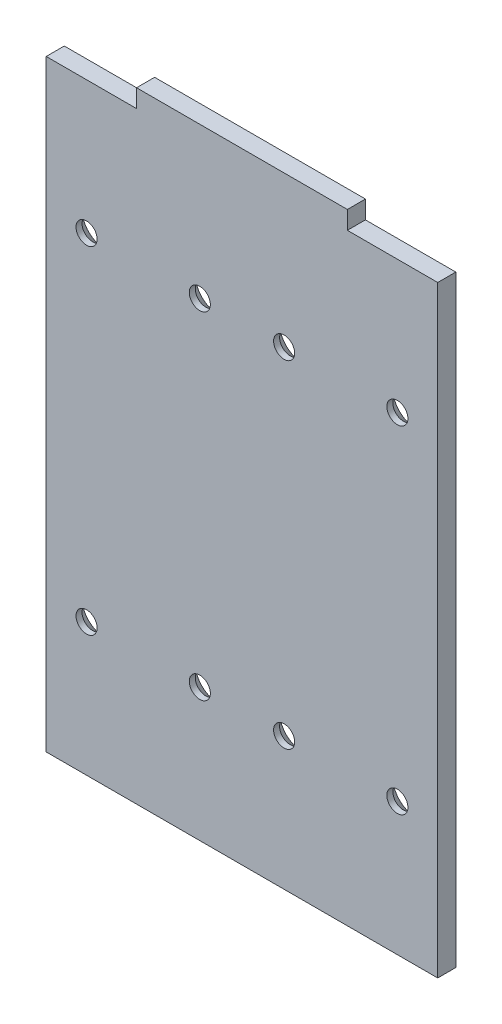
ISO-10303-21;
HEADER;
FILE_DESCRIPTION(('STEP AP214'),'2;1');
FILE_NAME('part.step','',(''),(''),'','','');
FILE_SCHEMA(('AUTOMOTIVE_DESIGN { 1 0 10303 214 1 1 1 1 }'));
ENDSEC;
DATA;
#1=APPLICATION_CONTEXT('core data for automotive mechanical design processes');
#2=APPLICATION_PROTOCOL_DEFINITION('international standard','automotive_design',2000,#1);
#3=PRODUCT_CONTEXT('',#1,'mechanical');
#4=PRODUCT('Part','Part','',(#3));
#5=PRODUCT_RELATED_PRODUCT_CATEGORY('part','',(#4));
#6=PRODUCT_DEFINITION_FORMATION('','',#4);
#7=PRODUCT_DEFINITION_CONTEXT('part definition',#1,'design');
#8=PRODUCT_DEFINITION('design','',#6,#7);
#9=PRODUCT_DEFINITION_SHAPE('','',#8);
#10=(LENGTH_UNIT() NAMED_UNIT(*) SI_UNIT(.MILLI.,.METRE.));
#11=(NAMED_UNIT(*) PLANE_ANGLE_UNIT() SI_UNIT($,.RADIAN.));
#12=(NAMED_UNIT(*) SI_UNIT($,.STERADIAN.) SOLID_ANGLE_UNIT());
#13=UNCERTAINTY_MEASURE_WITH_UNIT(LENGTH_MEASURE(1.E-05),#10,'distance_accuracy_value','');
#14=(GEOMETRIC_REPRESENTATION_CONTEXT(3) GLOBAL_UNCERTAINTY_ASSIGNED_CONTEXT((#13)) GLOBAL_UNIT_ASSIGNED_CONTEXT((#10,
#11,#12)) REPRESENTATION_CONTEXT('',''));
#15=CARTESIAN_POINT('',(0.,0.,0.));
#16=DIRECTION('',(0.,0.,1.));
#17=DIRECTION('',(1.,0.,0.));
#18=AXIS2_PLACEMENT_3D('',#15,#16,#17);
#19=CARTESIAN_POINT('',(0.,50.,3.));
#20=DIRECTION('',(0.,1.,0.));
#21=DIRECTION('',(0.,0.,1.));
#22=AXIS2_PLACEMENT_3D('',#19,#20,#21);
#23=PLANE('',#22);
#24=DIRECTION('',(1.,0.,0.));
#25=VECTOR('',#24,1.);
#26=CARTESIAN_POINT('',(0.,50.,0.));
#27=LINE('',#26,#25);
#28=CARTESIAN_POINT('',(17.5,50.,0.));
#29=VERTEX_POINT('',#28);
#30=CARTESIAN_POINT('',(32.5,50.,0.));
#31=VERTEX_POINT('',#30);
#32=EDGE_CURVE('E140',#29,#31,#27,.T.);
#33=ORIENTED_EDGE('',*,*,#32,.F.);
#34=DIRECTION('',(0.,0.,-1.));
#35=VECTOR('',#34,1.);
#36=CARTESIAN_POINT('',(17.5,50.,3.));
#37=LINE('',#36,#35);
#38=CARTESIAN_POINT('',(17.5,50.,3.));
#39=VERTEX_POINT('',#38);
#40=EDGE_CURVE('E97',#39,#29,#37,.T.);
#41=ORIENTED_EDGE('',*,*,#40,.F.);
#42=DIRECTION('',(1.,0.,0.));
#43=VECTOR('',#42,1.);
#44=CARTESIAN_POINT('',(0.,50.,3.));
#45=LINE('',#44,#43);
#46=CARTESIAN_POINT('',(32.5,50.,3.));
#47=VERTEX_POINT('',#46);
#48=EDGE_CURVE('E135',#39,#47,#45,.T.);
#49=ORIENTED_EDGE('',*,*,#48,.T.);
#50=DIRECTION('',(0.,0.,-1.));
#51=VECTOR('',#50,1.);
#52=CARTESIAN_POINT('',(32.5,50.,3.));
#53=LINE('',#52,#51);
#54=EDGE_CURVE('E92',#47,#31,#53,.T.);
#55=ORIENTED_EDGE('',*,*,#54,.T.);
#56=EDGE_LOOP('',(#33,#41,#49,#55));
#57=FACE_BOUND('',#56,.T.);
#58=ADVANCED_FACE('F39',(#57),#23,.T.);
#59=CARTESIAN_POINT('',(17.5,0.,3.));
#60=DIRECTION('',(-1.,0.,0.));
#61=DIRECTION('',(0.,0.,1.));
#62=AXIS2_PLACEMENT_3D('',#59,#60,#61);
#63=PLANE('',#62);
#64=DIRECTION('',(0.,1.,0.));
#65=VECTOR('',#64,1.);
#66=CARTESIAN_POINT('',(17.5,0.,0.));
#67=LINE('',#66,#65);
#68=CARTESIAN_POINT('',(17.5,53.,0.));
#69=VERTEX_POINT('',#68);
#70=EDGE_CURVE('E143',#29,#69,#67,.T.);
#71=ORIENTED_EDGE('',*,*,#70,.T.);
#72=DIRECTION('',(0.,0.,-1.));
#73=VECTOR('',#72,1.);
#74=CARTESIAN_POINT('',(17.5,53.,3.));
#75=LINE('',#74,#73);
#76=CARTESIAN_POINT('',(17.5,53.,3.));
#77=VERTEX_POINT('',#76);
#78=EDGE_CURVE('E165',#77,#69,#75,.T.);
#79=ORIENTED_EDGE('',*,*,#78,.F.);
#80=DIRECTION('',(0.,1.,0.));
#81=VECTOR('',#80,1.);
#82=CARTESIAN_POINT('',(17.5,0.,3.));
#83=LINE('',#82,#81);
#84=EDGE_CURVE('E261',#39,#77,#83,.T.);
#85=ORIENTED_EDGE('',*,*,#84,.F.);
#86=ORIENTED_EDGE('',*,*,#40,.T.);
#87=EDGE_LOOP('',(#71,#79,#85,#86));
#88=FACE_BOUND('',#87,.T.);
#89=ADVANCED_FACE('F232',(#88),#63,.F.);
#90=CARTESIAN_POINT('',(0.,53.,3.));
#91=DIRECTION('',(0.,1.,0.));
#92=DIRECTION('',(0.,0.,1.));
#93=AXIS2_PLACEMENT_3D('',#90,#91,#92);
#94=PLANE('',#93);
#95=DIRECTION('',(1.,0.,0.));
#96=VECTOR('',#95,1.);
#97=CARTESIAN_POINT('',(0.,53.,0.));
#98=LINE('',#97,#96);
#99=CARTESIAN_POINT('',(-17.5,53.,0.));
#100=VERTEX_POINT('',#99);
#101=EDGE_CURVE('E148',#100,#69,#98,.T.);
#102=ORIENTED_EDGE('',*,*,#101,.F.);
#103=DIRECTION('',(0.,0.,-1.));
#104=VECTOR('',#103,1.);
#105=CARTESIAN_POINT('',(-17.5,53.,3.));
#106=LINE('',#105,#104);
#107=CARTESIAN_POINT('',(-17.5,53.,3.));
#108=VERTEX_POINT('',#107);
#109=EDGE_CURVE('E163',#108,#100,#106,.T.);
#110=ORIENTED_EDGE('',*,*,#109,.F.);
#111=DIRECTION('',(1.,0.,0.));
#112=VECTOR('',#111,1.);
#113=CARTESIAN_POINT('',(0.,53.,3.));
#114=LINE('',#113,#112);
#115=EDGE_CURVE('E260',#108,#77,#114,.T.);
#116=ORIENTED_EDGE('',*,*,#115,.T.);
#117=ORIENTED_EDGE('',*,*,#78,.T.);
#118=EDGE_LOOP('',(#102,#110,#116,#117));
#119=FACE_BOUND('',#118,.T.);
#120=ADVANCED_FACE('F238',(#119),#94,.T.);
#121=CARTESIAN_POINT('',(-17.5,0.,3.));
#122=DIRECTION('',(-1.,0.,0.));
#123=DIRECTION('',(0.,0.,1.));
#124=AXIS2_PLACEMENT_3D('',#121,#122,#123);
#125=PLANE('',#124);
#126=DIRECTION('',(0.,1.,0.));
#127=VECTOR('',#126,1.);
#128=CARTESIAN_POINT('',(-17.5,0.,0.));
#129=LINE('',#128,#127);
#130=CARTESIAN_POINT('',(-17.5,50.,0.));
#131=VERTEX_POINT('',#130);
#132=EDGE_CURVE('E151',#131,#100,#129,.T.);
#133=ORIENTED_EDGE('',*,*,#132,.F.);
#134=DIRECTION('',(0.,0.,-1.));
#135=VECTOR('',#134,1.);
#136=CARTESIAN_POINT('',(-17.5,50.,3.));
#137=LINE('',#136,#135);
#138=CARTESIAN_POINT('',(-17.5,50.,3.));
#139=VERTEX_POINT('',#138);
#140=EDGE_CURVE('E161',#139,#131,#137,.T.);
#141=ORIENTED_EDGE('',*,*,#140,.F.);
#142=DIRECTION('',(0.,1.,0.));
#143=VECTOR('',#142,1.);
#144=CARTESIAN_POINT('',(-17.5,0.,3.));
#145=LINE('',#144,#143);
#146=EDGE_CURVE('E133',#139,#108,#145,.T.);
#147=ORIENTED_EDGE('',*,*,#146,.T.);
#148=ORIENTED_EDGE('',*,*,#109,.T.);
#149=EDGE_LOOP('',(#133,#141,#147,#148));
#150=FACE_BOUND('',#149,.T.);
#151=ADVANCED_FACE('F244',(#150),#125,.T.);
#152=CARTESIAN_POINT('',(-32.5,50.,0.));
#153=VERTEX_POINT('',#152);
#154=EDGE_CURVE('E145',#153,#131,#27,.T.);
#155=ORIENTED_EDGE('',*,*,#154,.F.);
#156=DIRECTION('',(0.,0.,-1.));
#157=VECTOR('',#156,1.);
#158=CARTESIAN_POINT('',(-32.5,50.,3.));
#159=LINE('',#158,#157);
#160=CARTESIAN_POINT('',(-32.5,50.,3.));
#161=VERTEX_POINT('',#160);
#162=EDGE_CURVE('E121',#161,#153,#159,.T.);
#163=ORIENTED_EDGE('',*,*,#162,.F.);
#164=EDGE_CURVE('E131',#161,#139,#45,.T.);
#165=ORIENTED_EDGE('',*,*,#164,.T.);
#166=ORIENTED_EDGE('',*,*,#140,.T.);
#167=EDGE_LOOP('',(#155,#163,#165,#166));
#168=FACE_BOUND('',#167,.T.);
#169=ADVANCED_FACE('F234',(#168),#23,.T.);
#170=CARTESIAN_POINT('',(-32.5,0.,3.));
#171=DIRECTION('',(-1.,0.,0.));
#172=DIRECTION('',(0.,0.,1.));
#173=AXIS2_PLACEMENT_3D('',#170,#171,#172);
#174=PLANE('',#173);
#175=DIRECTION('',(0.,1.,0.));
#176=VECTOR('',#175,1.);
#177=CARTESIAN_POINT('',(-32.5,0.,0.));
#178=LINE('',#177,#176);
#179=CARTESIAN_POINT('',(-32.5,-50.,0.));
#180=VERTEX_POINT('',#179);
#181=EDGE_CURVE('E120',#180,#153,#178,.T.);
#182=ORIENTED_EDGE('',*,*,#181,.F.);
#183=DIRECTION('',(0.,0.,-1.));
#184=VECTOR('',#183,1.);
#185=CARTESIAN_POINT('',(-32.5,-50.,3.));
#186=LINE('',#185,#184);
#187=CARTESIAN_POINT('',(-32.5,-50.,3.));
#188=VERTEX_POINT('',#187);
#189=EDGE_CURVE('E114',#188,#180,#186,.T.);
#190=ORIENTED_EDGE('',*,*,#189,.F.);
#191=DIRECTION('',(0.,1.,0.));
#192=VECTOR('',#191,1.);
#193=CARTESIAN_POINT('',(-32.5,0.,3.));
#194=LINE('',#193,#192);
#195=EDGE_CURVE('E118',#188,#161,#194,.T.);
#196=ORIENTED_EDGE('',*,*,#195,.T.);
#197=ORIENTED_EDGE('',*,*,#162,.T.);
#198=EDGE_LOOP('',(#182,#190,#196,#197));
#199=FACE_BOUND('',#198,.T.);
#200=ADVANCED_FACE('F116',(#199),#174,.T.);
#201=CARTESIAN_POINT('',(0.,-50.,3.));
#202=DIRECTION('',(0.,1.,0.));
#203=DIRECTION('',(0.,0.,1.));
#204=AXIS2_PLACEMENT_3D('',#201,#202,#203);
#205=PLANE('',#204);
#206=DIRECTION('',(1.,0.,0.));
#207=VECTOR('',#206,1.);
#208=CARTESIAN_POINT('',(0.,-50.,0.));
#209=LINE('',#208,#207);
#210=CARTESIAN_POINT('',(32.5,-50.,0.));
#211=VERTEX_POINT('',#210);
#212=EDGE_CURVE('E85',#180,#211,#209,.T.);
#213=ORIENTED_EDGE('',*,*,#212,.T.);
#214=DIRECTION('',(0.,0.,-1.));
#215=VECTOR('',#214,1.);
#216=CARTESIAN_POINT('',(32.5,-50.,3.));
#217=LINE('',#216,#215);
#218=CARTESIAN_POINT('',(32.5,-50.,3.));
#219=VERTEX_POINT('',#218);
#220=EDGE_CURVE('E122',#219,#211,#217,.T.);
#221=ORIENTED_EDGE('',*,*,#220,.F.);
#222=DIRECTION('',(1.,0.,0.));
#223=VECTOR('',#222,1.);
#224=CARTESIAN_POINT('',(0.,-50.,3.));
#225=LINE('',#224,#223);
#226=EDGE_CURVE('E124',#188,#219,#225,.T.);
#227=ORIENTED_EDGE('',*,*,#226,.F.);
#228=ORIENTED_EDGE('',*,*,#189,.T.);
#229=EDGE_LOOP('',(#213,#221,#227,#228));
#230=FACE_BOUND('',#229,.T.);
#231=ADVANCED_FACE('F125',(#230),#205,.F.);
#232=CARTESIAN_POINT('',(32.5,0.,3.));
#233=DIRECTION('',(-1.,0.,0.));
#234=DIRECTION('',(0.,0.,1.));
#235=AXIS2_PLACEMENT_3D('',#232,#233,#234);
#236=PLANE('',#235);
#237=DIRECTION('',(0.,1.,0.));
#238=VECTOR('',#237,1.);
#239=CARTESIAN_POINT('',(32.5,0.,0.));
#240=LINE('',#239,#238);
#241=EDGE_CURVE('E156',#211,#31,#240,.T.);
#242=ORIENTED_EDGE('',*,*,#241,.T.);
#243=ORIENTED_EDGE('',*,*,#54,.F.);
#244=DIRECTION('',(0.,1.,0.));
#245=VECTOR('',#244,1.);
#246=CARTESIAN_POINT('',(32.5,0.,3.));
#247=LINE('',#246,#245);
#248=EDGE_CURVE('E57',#219,#47,#247,.T.);
#249=ORIENTED_EDGE('',*,*,#248,.F.);
#250=ORIENTED_EDGE('',*,*,#220,.T.);
#251=EDGE_LOOP('',(#242,#243,#249,#250));
#252=FACE_BOUND('',#251,.T.);
#253=ADVANCED_FACE('F290',(#252),#236,.F.);
#254=CARTESIAN_POINT('',(0.,0.,3.));
#255=DIRECTION('',(0.,0.,1.));
#256=DIRECTION('',(1.,0.,0.));
#257=AXIS2_PLACEMENT_3D('',#254,#255,#256);
#258=PLANE('',#257);
#259=CARTESIAN_POINT('',(-25.8,-27.95,3.));
#260=DIRECTION('',(0.,0.,1.));
#261=DIRECTION('',(1.,0.,0.));
#262=AXIS2_PLACEMENT_3D('',#259,#260,#261);
#263=CIRCLE('',#262,1.75);
#264=CARTESIAN_POINT('',(-24.05,-27.95,3.));
#265=VERTEX_POINT('',#264);
#266=EDGE_CURVE('E273',#265,#265,#263,.T.);
#267=ORIENTED_EDGE('',*,*,#266,.F.);
#268=EDGE_LOOP('',(#267));
#269=FACE_BOUND('',#268,.T.);
#270=CARTESIAN_POINT('',(25.8,27.95,3.));
#271=DIRECTION('',(0.,0.,1.));
#272=DIRECTION('',(1.,0.,0.));
#273=AXIS2_PLACEMENT_3D('',#270,#271,#272);
#274=CIRCLE('',#273,1.75);
#275=CARTESIAN_POINT('',(27.55,27.95,3.));
#276=VERTEX_POINT('',#275);
#277=EDGE_CURVE('E270',#276,#276,#274,.T.);
#278=ORIENTED_EDGE('',*,*,#277,.F.);
#279=EDGE_LOOP('',(#278));
#280=FACE_BOUND('',#279,.T.);
#281=CARTESIAN_POINT('',(7.00000000000001,27.95,3.));
#282=DIRECTION('',(0.,0.,1.));
#283=DIRECTION('',(1.,0.,0.));
#284=AXIS2_PLACEMENT_3D('',#281,#282,#283);
#285=CIRCLE('',#284,1.75);
#286=CARTESIAN_POINT('',(8.75000000000001,27.95,3.));
#287=VERTEX_POINT('',#286);
#288=EDGE_CURVE('E267',#287,#287,#285,.T.);
#289=ORIENTED_EDGE('',*,*,#288,.F.);
#290=EDGE_LOOP('',(#289));
#291=FACE_BOUND('',#290,.T.);
#292=CARTESIAN_POINT('',(-7.00000000000001,27.95,3.));
#293=DIRECTION('',(0.,0.,1.));
#294=DIRECTION('',(1.,0.,0.));
#295=AXIS2_PLACEMENT_3D('',#292,#293,#294);
#296=CIRCLE('',#295,1.75);
#297=CARTESIAN_POINT('',(-5.25000000000001,27.95,3.));
#298=VERTEX_POINT('',#297);
#299=EDGE_CURVE('E266',#298,#298,#296,.T.);
#300=ORIENTED_EDGE('',*,*,#299,.F.);
#301=EDGE_LOOP('',(#300));
#302=FACE_BOUND('',#301,.T.);
#303=CARTESIAN_POINT('',(-6.99999999999999,-27.95,3.));
#304=DIRECTION('',(0.,0.,1.));
#305=DIRECTION('',(1.,0.,0.));
#306=AXIS2_PLACEMENT_3D('',#303,#304,#305);
#307=CIRCLE('',#306,1.75);
#308=CARTESIAN_POINT('',(-5.24999999999999,-27.95,3.));
#309=VERTEX_POINT('',#308);
#310=EDGE_CURVE('E276',#309,#309,#307,.T.);
#311=ORIENTED_EDGE('',*,*,#310,.F.);
#312=EDGE_LOOP('',(#311));
#313=FACE_BOUND('',#312,.T.);
#314=CARTESIAN_POINT('',(6.99999999999999,-27.95,3.));
#315=DIRECTION('',(0.,0.,1.));
#316=DIRECTION('',(1.,0.,0.));
#317=AXIS2_PLACEMENT_3D('',#314,#315,#316);
#318=CIRCLE('',#317,1.75);
#319=CARTESIAN_POINT('',(8.74999999999999,-27.95,3.));
#320=VERTEX_POINT('',#319);
#321=EDGE_CURVE('E282',#320,#320,#318,.T.);
#322=ORIENTED_EDGE('',*,*,#321,.F.);
#323=EDGE_LOOP('',(#322));
#324=FACE_BOUND('',#323,.T.);
#325=CARTESIAN_POINT('',(25.8,-27.95,3.));
#326=DIRECTION('',(0.,0.,1.));
#327=DIRECTION('',(1.,0.,0.));
#328=AXIS2_PLACEMENT_3D('',#325,#326,#327);
#329=CIRCLE('',#328,1.75);
#330=CARTESIAN_POINT('',(27.55,-27.95,3.));
#331=VERTEX_POINT('',#330);
#332=EDGE_CURVE('E279',#331,#331,#329,.T.);
#333=ORIENTED_EDGE('',*,*,#332,.F.);
#334=EDGE_LOOP('',(#333));
#335=FACE_BOUND('',#334,.T.);
#336=CARTESIAN_POINT('',(-25.8,27.95,3.));
#337=DIRECTION('',(0.,0.,1.));
#338=DIRECTION('',(1.,0.,0.));
#339=AXIS2_PLACEMENT_3D('',#336,#337,#338);
#340=CIRCLE('',#339,1.75);
#341=CARTESIAN_POINT('',(-24.05,27.95,3.));
#342=VERTEX_POINT('',#341);
#343=EDGE_CURVE('E144',#342,#342,#340,.T.);
#344=ORIENTED_EDGE('',*,*,#343,.F.);
#345=EDGE_LOOP('',(#344));
#346=FACE_BOUND('',#345,.T.);
#347=ORIENTED_EDGE('',*,*,#48,.F.);
#348=ORIENTED_EDGE('',*,*,#84,.T.);
#349=ORIENTED_EDGE('',*,*,#115,.F.);
#350=ORIENTED_EDGE('',*,*,#146,.F.);
#351=ORIENTED_EDGE('',*,*,#164,.F.);
#352=ORIENTED_EDGE('',*,*,#195,.F.);
#353=ORIENTED_EDGE('',*,*,#226,.T.);
#354=ORIENTED_EDGE('',*,*,#248,.T.);
#355=EDGE_LOOP('',(#347,#348,#349,#350,#351,#352,#353,#354));
#356=FACE_BOUND('',#355,.T.);
#357=ADVANCED_FACE('F128',(#269,#280,#291,#302,#313,#324,#335,#346,#356),#258,.T.);
#358=CARTESIAN_POINT('',(0.,0.,0.));
#359=DIRECTION('',(0.,0.,1.));
#360=DIRECTION('',(1.,0.,0.));
#361=AXIS2_PLACEMENT_3D('',#358,#359,#360);
#362=PLANE('',#361);
#363=CARTESIAN_POINT('',(-25.8,27.95,0.));
#364=DIRECTION('',(0.,0.,1.));
#365=DIRECTION('',(1.,0.,0.));
#366=AXIS2_PLACEMENT_3D('',#363,#364,#365);
#367=CIRCLE('',#366,3.74999999999999);
#368=CARTESIAN_POINT('',(-22.05,27.95,0.));
#369=VERTEX_POINT('',#368);
#370=EDGE_CURVE('E189',#369,#369,#367,.T.);
#371=ORIENTED_EDGE('',*,*,#370,.T.);
#372=EDGE_LOOP('',(#371));
#373=FACE_BOUND('',#372,.T.);
#374=CARTESIAN_POINT('',(-7.00000000000001,27.95,0.));
#375=DIRECTION('',(0.,0.,1.));
#376=DIRECTION('',(1.,0.,0.));
#377=AXIS2_PLACEMENT_3D('',#374,#375,#376);
#378=CIRCLE('',#377,3.74999999999999);
#379=CARTESIAN_POINT('',(-3.25000000000002,27.95,0.));
#380=VERTEX_POINT('',#379);
#381=EDGE_CURVE('E186',#380,#380,#378,.T.);
#382=ORIENTED_EDGE('',*,*,#381,.T.);
#383=EDGE_LOOP('',(#382));
#384=FACE_BOUND('',#383,.T.);
#385=CARTESIAN_POINT('',(7.00000000000001,27.95,0.));
#386=DIRECTION('',(0.,0.,1.));
#387=DIRECTION('',(1.,0.,0.));
#388=AXIS2_PLACEMENT_3D('',#385,#386,#387);
#389=CIRCLE('',#388,3.74999999999999);
#390=CARTESIAN_POINT('',(10.75,27.95,0.));
#391=VERTEX_POINT('',#390);
#392=EDGE_CURVE('E183',#391,#391,#389,.T.);
#393=ORIENTED_EDGE('',*,*,#392,.T.);
#394=EDGE_LOOP('',(#393));
#395=FACE_BOUND('',#394,.T.);
#396=CARTESIAN_POINT('',(25.8,27.95,0.));
#397=DIRECTION('',(0.,0.,1.));
#398=DIRECTION('',(1.,0.,0.));
#399=AXIS2_PLACEMENT_3D('',#396,#397,#398);
#400=CIRCLE('',#399,3.74999999999999);
#401=CARTESIAN_POINT('',(29.55,27.95,0.));
#402=VERTEX_POINT('',#401);
#403=EDGE_CURVE('E180',#402,#402,#400,.T.);
#404=ORIENTED_EDGE('',*,*,#403,.T.);
#405=EDGE_LOOP('',(#404));
#406=FACE_BOUND('',#405,.T.);
#407=CARTESIAN_POINT('',(25.8,-27.95,0.));
#408=DIRECTION('',(0.,0.,1.));
#409=DIRECTION('',(1.,0.,0.));
#410=AXIS2_PLACEMENT_3D('',#407,#408,#409);
#411=CIRCLE('',#410,3.74999999999999);
#412=CARTESIAN_POINT('',(29.55,-27.95,0.));
#413=VERTEX_POINT('',#412);
#414=EDGE_CURVE('E177',#413,#413,#411,.T.);
#415=ORIENTED_EDGE('',*,*,#414,.T.);
#416=EDGE_LOOP('',(#415));
#417=FACE_BOUND('',#416,.T.);
#418=CARTESIAN_POINT('',(6.99999999999999,-27.95,0.));
#419=DIRECTION('',(0.,0.,1.));
#420=DIRECTION('',(1.,0.,0.));
#421=AXIS2_PLACEMENT_3D('',#418,#419,#420);
#422=CIRCLE('',#421,3.74999999999999);
#423=CARTESIAN_POINT('',(10.75,-27.95,0.));
#424=VERTEX_POINT('',#423);
#425=EDGE_CURVE('E174',#424,#424,#422,.T.);
#426=ORIENTED_EDGE('',*,*,#425,.T.);
#427=EDGE_LOOP('',(#426));
#428=FACE_BOUND('',#427,.T.);
#429=CARTESIAN_POINT('',(-6.99999999999999,-27.95,0.));
#430=DIRECTION('',(0.,0.,1.));
#431=DIRECTION('',(1.,0.,0.));
#432=AXIS2_PLACEMENT_3D('',#429,#430,#431);
#433=CIRCLE('',#432,3.74999999999999);
#434=CARTESIAN_POINT('',(-3.25,-27.95,0.));
#435=VERTEX_POINT('',#434);
#436=EDGE_CURVE('E171',#435,#435,#433,.T.);
#437=ORIENTED_EDGE('',*,*,#436,.T.);
#438=EDGE_LOOP('',(#437));
#439=FACE_BOUND('',#438,.T.);
#440=CARTESIAN_POINT('',(-25.8,-27.95,0.));
#441=DIRECTION('',(0.,0.,1.));
#442=DIRECTION('',(1.,0.,0.));
#443=AXIS2_PLACEMENT_3D('',#440,#441,#442);
#444=CIRCLE('',#443,3.74999999999999);
#445=CARTESIAN_POINT('',(-22.05,-27.95,0.));
#446=VERTEX_POINT('',#445);
#447=EDGE_CURVE('E168',#446,#446,#444,.T.);
#448=ORIENTED_EDGE('',*,*,#447,.T.);
#449=EDGE_LOOP('',(#448));
#450=FACE_BOUND('',#449,.T.);
#451=ORIENTED_EDGE('',*,*,#32,.T.);
#452=ORIENTED_EDGE('',*,*,#241,.F.);
#453=ORIENTED_EDGE('',*,*,#212,.F.);
#454=ORIENTED_EDGE('',*,*,#181,.T.);
#455=ORIENTED_EDGE('',*,*,#154,.T.);
#456=ORIENTED_EDGE('',*,*,#132,.T.);
#457=ORIENTED_EDGE('',*,*,#101,.T.);
#458=ORIENTED_EDGE('',*,*,#70,.F.);
#459=EDGE_LOOP('',(#451,#452,#453,#454,#455,#456,#457,#458));
#460=FACE_BOUND('',#459,.T.);
#461=ADVANCED_FACE('F221',(#373,#384,#395,#406,#417,#428,#439,#450,#460),#362,.F.);
#462=CARTESIAN_POINT('',(-25.8,27.95,-7.));
#463=DIRECTION('',(0.,0.,1.));
#464=DIRECTION('',(1.,0.,0.));
#465=AXIS2_PLACEMENT_3D('',#462,#463,#464);
#466=CYLINDRICAL_SURFACE('',#465,1.75);
#467=CARTESIAN_POINT('',(-25.8,27.95,2.));
#468=DIRECTION('',(0.,0.,1.));
#469=DIRECTION('',(1.,0.,0.));
#470=AXIS2_PLACEMENT_3D('',#467,#468,#469);
#471=CIRCLE('',#470,1.75);
#472=CARTESIAN_POINT('',(-24.05,27.95,2.));
#473=VERTEX_POINT('',#472);
#474=EDGE_CURVE('E192',#473,#473,#471,.F.);
#475=ORIENTED_EDGE('',*,*,#474,.T.);
#476=EDGE_LOOP('',(#475));
#477=FACE_BOUND('',#476,.T.);
#478=ORIENTED_EDGE('',*,*,#343,.T.);
#479=EDGE_LOOP('',(#478));
#480=FACE_BOUND('',#479,.T.);
#481=ADVANCED_FACE('F224',(#477,#480),#466,.F.);
#482=CARTESIAN_POINT('',(25.8,-27.95,-7.));
#483=DIRECTION('',(0.,0.,1.));
#484=DIRECTION('',(1.,0.,0.));
#485=AXIS2_PLACEMENT_3D('',#482,#483,#484);
#486=CYLINDRICAL_SURFACE('',#485,1.75);
#487=CARTESIAN_POINT('',(25.8,-27.95,2.));
#488=DIRECTION('',(0.,0.,1.));
#489=DIRECTION('',(1.,0.,0.));
#490=AXIS2_PLACEMENT_3D('',#487,#488,#489);
#491=CIRCLE('',#490,1.75);
#492=CARTESIAN_POINT('',(27.55,-27.95,2.));
#493=VERTEX_POINT('',#492);
#494=EDGE_CURVE('E204',#493,#493,#491,.F.);
#495=ORIENTED_EDGE('',*,*,#494,.T.);
#496=EDGE_LOOP('',(#495));
#497=FACE_BOUND('',#496,.T.);
#498=ORIENTED_EDGE('',*,*,#332,.T.);
#499=EDGE_LOOP('',(#498));
#500=FACE_BOUND('',#499,.T.);
#501=ADVANCED_FACE('F300',(#497,#500),#486,.F.);
#502=CARTESIAN_POINT('',(6.99999999999999,-27.95,-7.));
#503=DIRECTION('',(0.,0.,1.));
#504=DIRECTION('',(1.,0.,0.));
#505=AXIS2_PLACEMENT_3D('',#502,#503,#504);
#506=CYLINDRICAL_SURFACE('',#505,1.75);
#507=CARTESIAN_POINT('',(6.99999999999999,-27.95,2.));
#508=DIRECTION('',(0.,0.,1.));
#509=DIRECTION('',(1.,0.,0.));
#510=AXIS2_PLACEMENT_3D('',#507,#508,#509);
#511=CIRCLE('',#510,1.75);
#512=CARTESIAN_POINT('',(8.74999999999999,-27.95,2.));
#513=VERTEX_POINT('',#512);
#514=EDGE_CURVE('E207',#513,#513,#511,.F.);
#515=ORIENTED_EDGE('',*,*,#514,.T.);
#516=EDGE_LOOP('',(#515));
#517=FACE_BOUND('',#516,.T.);
#518=ORIENTED_EDGE('',*,*,#321,.T.);
#519=EDGE_LOOP('',(#518));
#520=FACE_BOUND('',#519,.T.);
#521=ADVANCED_FACE('F306',(#517,#520),#506,.F.);
#522=CARTESIAN_POINT('',(-6.99999999999999,-27.95,-7.));
#523=DIRECTION('',(0.,0.,1.));
#524=DIRECTION('',(1.,0.,0.));
#525=AXIS2_PLACEMENT_3D('',#522,#523,#524);
#526=CYLINDRICAL_SURFACE('',#525,1.75);
#527=CARTESIAN_POINT('',(-6.99999999999999,-27.95,2.));
#528=DIRECTION('',(0.,0.,1.));
#529=DIRECTION('',(1.,0.,0.));
#530=AXIS2_PLACEMENT_3D('',#527,#528,#529);
#531=CIRCLE('',#530,1.75);
#532=CARTESIAN_POINT('',(-5.24999999999999,-27.95,2.));
#533=VERTEX_POINT('',#532);
#534=EDGE_CURVE('E49',#533,#533,#531,.F.);
#535=ORIENTED_EDGE('',*,*,#534,.T.);
#536=EDGE_LOOP('',(#535));
#537=FACE_BOUND('',#536,.T.);
#538=ORIENTED_EDGE('',*,*,#310,.T.);
#539=EDGE_LOOP('',(#538));
#540=FACE_BOUND('',#539,.T.);
#541=ADVANCED_FACE('F212',(#537,#540),#526,.F.);
#542=CARTESIAN_POINT('',(-7.00000000000001,27.95,-7.));
#543=DIRECTION('',(0.,0.,1.));
#544=DIRECTION('',(1.,0.,0.));
#545=AXIS2_PLACEMENT_3D('',#542,#543,#544);
#546=CYLINDRICAL_SURFACE('',#545,1.75);
#547=CARTESIAN_POINT('',(-7.00000000000001,27.95,2.));
#548=DIRECTION('',(0.,0.,1.));
#549=DIRECTION('',(1.,0.,0.));
#550=AXIS2_PLACEMENT_3D('',#547,#548,#549);
#551=CIRCLE('',#550,1.75);
#552=CARTESIAN_POINT('',(-5.25000000000001,27.95,2.));
#553=VERTEX_POINT('',#552);
#554=EDGE_CURVE('E195',#553,#553,#551,.F.);
#555=ORIENTED_EDGE('',*,*,#554,.T.);
#556=EDGE_LOOP('',(#555));
#557=FACE_BOUND('',#556,.T.);
#558=ORIENTED_EDGE('',*,*,#299,.T.);
#559=EDGE_LOOP('',(#558));
#560=FACE_BOUND('',#559,.T.);
#561=ADVANCED_FACE('F365',(#557,#560),#546,.F.);
#562=CARTESIAN_POINT('',(7.00000000000001,27.95,-7.));
#563=DIRECTION('',(0.,0.,1.));
#564=DIRECTION('',(1.,0.,0.));
#565=AXIS2_PLACEMENT_3D('',#562,#563,#564);
#566=CYLINDRICAL_SURFACE('',#565,1.75);
#567=CARTESIAN_POINT('',(7.00000000000001,27.95,2.));
#568=DIRECTION('',(0.,0.,1.));
#569=DIRECTION('',(1.,0.,0.));
#570=AXIS2_PLACEMENT_3D('',#567,#568,#569);
#571=CIRCLE('',#570,1.75);
#572=CARTESIAN_POINT('',(8.75000000000001,27.95,2.));
#573=VERTEX_POINT('',#572);
#574=EDGE_CURVE('E198',#573,#573,#571,.F.);
#575=ORIENTED_EDGE('',*,*,#574,.T.);
#576=EDGE_LOOP('',(#575));
#577=FACE_BOUND('',#576,.T.);
#578=ORIENTED_EDGE('',*,*,#288,.T.);
#579=EDGE_LOOP('',(#578));
#580=FACE_BOUND('',#579,.T.);
#581=ADVANCED_FACE('F310',(#577,#580),#566,.F.);
#582=CARTESIAN_POINT('',(25.8,27.95,-7.));
#583=DIRECTION('',(0.,0.,1.));
#584=DIRECTION('',(1.,0.,0.));
#585=AXIS2_PLACEMENT_3D('',#582,#583,#584);
#586=CYLINDRICAL_SURFACE('',#585,1.75);
#587=CARTESIAN_POINT('',(25.8,27.95,2.));
#588=DIRECTION('',(0.,0.,1.));
#589=DIRECTION('',(1.,0.,0.));
#590=AXIS2_PLACEMENT_3D('',#587,#588,#589);
#591=CIRCLE('',#590,1.75);
#592=CARTESIAN_POINT('',(27.55,27.95,2.));
#593=VERTEX_POINT('',#592);
#594=EDGE_CURVE('E201',#593,#593,#591,.F.);
#595=ORIENTED_EDGE('',*,*,#594,.T.);
#596=EDGE_LOOP('',(#595));
#597=FACE_BOUND('',#596,.T.);
#598=ORIENTED_EDGE('',*,*,#277,.T.);
#599=EDGE_LOOP('',(#598));
#600=FACE_BOUND('',#599,.T.);
#601=ADVANCED_FACE('F382',(#597,#600),#586,.F.);
#602=CARTESIAN_POINT('',(-25.8,-27.95,-7.));
#603=DIRECTION('',(0.,0.,1.));
#604=DIRECTION('',(1.,0.,0.));
#605=AXIS2_PLACEMENT_3D('',#602,#603,#604);
#606=CYLINDRICAL_SURFACE('',#605,1.75);
#607=CARTESIAN_POINT('',(-25.8,-27.95,2.));
#608=DIRECTION('',(0.,0.,1.));
#609=DIRECTION('',(1.,0.,0.));
#610=AXIS2_PLACEMENT_3D('',#607,#608,#609);
#611=CIRCLE('',#610,1.75);
#612=CARTESIAN_POINT('',(-24.05,-27.95,2.));
#613=VERTEX_POINT('',#612);
#614=EDGE_CURVE('E11',#613,#613,#611,.F.);
#615=ORIENTED_EDGE('',*,*,#614,.T.);
#616=EDGE_LOOP('',(#615));
#617=FACE_BOUND('',#616,.T.);
#618=ORIENTED_EDGE('',*,*,#266,.T.);
#619=EDGE_LOOP('',(#618));
#620=FACE_BOUND('',#619,.T.);
#621=ADVANCED_FACE('F391',(#617,#620),#606,.F.);
#622=CARTESIAN_POINT('',(-25.8,27.95,0.));
#623=DIRECTION('',(0.,0.,-1.));
#624=DIRECTION('',(-1.,0.,0.));
#625=AXIS2_PLACEMENT_3D('',#622,#623,#624);
#626=CONICAL_SURFACE('',#625,3.74999999999999,0.785398163397446);
#627=ORIENTED_EDGE('',*,*,#474,.F.);
#628=EDGE_LOOP('',(#627));
#629=FACE_BOUND('',#628,.T.);
#630=ORIENTED_EDGE('',*,*,#370,.F.);
#631=EDGE_LOOP('',(#630));
#632=FACE_BOUND('',#631,.T.);
#633=ADVANCED_FACE('F401',(#629,#632),#626,.F.);
#634=CARTESIAN_POINT('',(-7.00000000000001,27.95,0.));
#635=DIRECTION('',(0.,0.,-1.));
#636=DIRECTION('',(-1.,0.,0.));
#637=AXIS2_PLACEMENT_3D('',#634,#635,#636);
#638=CONICAL_SURFACE('',#637,3.74999999999999,0.785398163397446);
#639=ORIENTED_EDGE('',*,*,#554,.F.);
#640=EDGE_LOOP('',(#639));
#641=FACE_BOUND('',#640,.T.);
#642=ORIENTED_EDGE('',*,*,#381,.F.);
#643=EDGE_LOOP('',(#642));
#644=FACE_BOUND('',#643,.T.);
#645=ADVANCED_FACE('F411',(#641,#644),#638,.F.);
#646=CARTESIAN_POINT('',(7.00000000000001,27.95,0.));
#647=DIRECTION('',(0.,0.,-1.));
#648=DIRECTION('',(-1.,0.,0.));
#649=AXIS2_PLACEMENT_3D('',#646,#647,#648);
#650=CONICAL_SURFACE('',#649,3.74999999999999,0.785398163397446);
#651=ORIENTED_EDGE('',*,*,#574,.F.);
#652=EDGE_LOOP('',(#651));
#653=FACE_BOUND('',#652,.T.);
#654=ORIENTED_EDGE('',*,*,#392,.F.);
#655=EDGE_LOOP('',(#654));
#656=FACE_BOUND('',#655,.T.);
#657=ADVANCED_FACE('F418',(#653,#656),#650,.F.);
#658=CARTESIAN_POINT('',(25.8,27.95,0.));
#659=DIRECTION('',(0.,0.,-1.));
#660=DIRECTION('',(-1.,0.,0.));
#661=AXIS2_PLACEMENT_3D('',#658,#659,#660);
#662=CONICAL_SURFACE('',#661,3.74999999999999,0.785398163397446);
#663=ORIENTED_EDGE('',*,*,#594,.F.);
#664=EDGE_LOOP('',(#663));
#665=FACE_BOUND('',#664,.T.);
#666=ORIENTED_EDGE('',*,*,#403,.F.);
#667=EDGE_LOOP('',(#666));
#668=FACE_BOUND('',#667,.T.);
#669=ADVANCED_FACE('F426',(#665,#668),#662,.F.);
#670=CARTESIAN_POINT('',(25.8,-27.95,0.));
#671=DIRECTION('',(0.,0.,-1.));
#672=DIRECTION('',(-1.,0.,0.));
#673=AXIS2_PLACEMENT_3D('',#670,#671,#672);
#674=CONICAL_SURFACE('',#673,3.74999999999999,0.785398163397446);
#675=ORIENTED_EDGE('',*,*,#494,.F.);
#676=EDGE_LOOP('',(#675));
#677=FACE_BOUND('',#676,.T.);
#678=ORIENTED_EDGE('',*,*,#414,.F.);
#679=EDGE_LOOP('',(#678));
#680=FACE_BOUND('',#679,.T.);
#681=ADVANCED_FACE('F434',(#677,#680),#674,.F.);
#682=CARTESIAN_POINT('',(6.99999999999999,-27.95,0.));
#683=DIRECTION('',(0.,0.,-1.));
#684=DIRECTION('',(-1.,0.,0.));
#685=AXIS2_PLACEMENT_3D('',#682,#683,#684);
#686=CONICAL_SURFACE('',#685,3.74999999999999,0.785398163397446);
#687=ORIENTED_EDGE('',*,*,#514,.F.);
#688=EDGE_LOOP('',(#687));
#689=FACE_BOUND('',#688,.T.);
#690=ORIENTED_EDGE('',*,*,#425,.F.);
#691=EDGE_LOOP('',(#690));
#692=FACE_BOUND('',#691,.T.);
#693=ADVANCED_FACE('F218',(#689,#692),#686,.F.);
#694=CARTESIAN_POINT('',(-6.99999999999999,-27.95,0.));
#695=DIRECTION('',(0.,0.,-1.));
#696=DIRECTION('',(-1.,0.,0.));
#697=AXIS2_PLACEMENT_3D('',#694,#695,#696);
#698=CONICAL_SURFACE('',#697,3.74999999999999,0.785398163397446);
#699=ORIENTED_EDGE('',*,*,#534,.F.);
#700=EDGE_LOOP('',(#699));
#701=FACE_BOUND('',#700,.T.);
#702=ORIENTED_EDGE('',*,*,#436,.F.);
#703=EDGE_LOOP('',(#702));
#704=FACE_BOUND('',#703,.T.);
#705=ADVANCED_FACE('F215',(#701,#704),#698,.F.);
#706=CARTESIAN_POINT('',(-25.8,-27.95,0.));
#707=DIRECTION('',(0.,0.,-1.));
#708=DIRECTION('',(-1.,0.,0.));
#709=AXIS2_PLACEMENT_3D('',#706,#707,#708);
#710=CONICAL_SURFACE('',#709,3.74999999999999,0.785398163397446);
#711=ORIENTED_EDGE('',*,*,#614,.F.);
#712=EDGE_LOOP('',(#711));
#713=FACE_BOUND('',#712,.T.);
#714=ORIENTED_EDGE('',*,*,#447,.F.);
#715=EDGE_LOOP('',(#714));
#716=FACE_BOUND('',#715,.T.);
#717=ADVANCED_FACE('F42',(#713,#716),#710,.F.);
#718=CLOSED_SHELL('',(#58,#89,#120,#151,#169,#200,#231,#253,#357,#461,#481,#501,#521,#541,#561,
#581,#601,#621,#633,#645,#657,#669,#681,#693,#705,#717));
#719=MANIFOLD_SOLID_BREP('B2',#718);
#720=ADVANCED_BREP_SHAPE_REPRESENTATION('',(#18,#719),#14);
#721=SHAPE_DEFINITION_REPRESENTATION(#9,#720);
ENDSEC;
END-ISO-10303-21;
